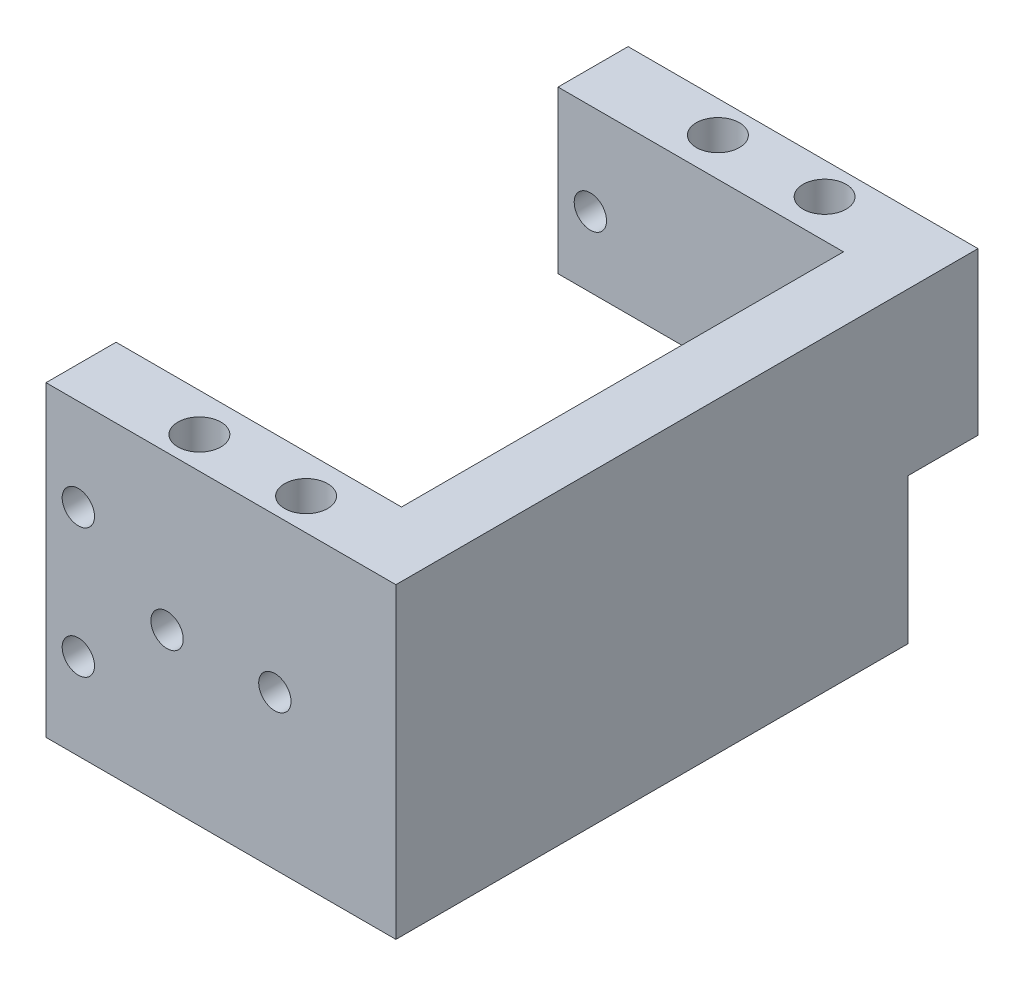
ISO-10303-21;
HEADER;
FILE_DESCRIPTION(('STEP AP214'),'2;1');
FILE_NAME('part.step','',(''),(''),'','','');
FILE_SCHEMA(('AUTOMOTIVE_DESIGN { 1 0 10303 214 1 1 1 1 }'));
ENDSEC;
DATA;
#1=APPLICATION_CONTEXT('core data for automotive mechanical design processes');
#2=APPLICATION_PROTOCOL_DEFINITION('international standard','automotive_design',2000,#1);
#3=PRODUCT_CONTEXT('',#1,'mechanical');
#4=PRODUCT('Part','Part','',(#3));
#5=PRODUCT_RELATED_PRODUCT_CATEGORY('part','',(#4));
#6=PRODUCT_DEFINITION_FORMATION('','',#4);
#7=PRODUCT_DEFINITION_CONTEXT('part definition',#1,'design');
#8=PRODUCT_DEFINITION('design','',#6,#7);
#9=PRODUCT_DEFINITION_SHAPE('','',#8);
#10=(LENGTH_UNIT() NAMED_UNIT(*) SI_UNIT(.MILLI.,.METRE.));
#11=(NAMED_UNIT(*) PLANE_ANGLE_UNIT() SI_UNIT($,.RADIAN.));
#12=(NAMED_UNIT(*) SI_UNIT($,.STERADIAN.) SOLID_ANGLE_UNIT());
#13=UNCERTAINTY_MEASURE_WITH_UNIT(LENGTH_MEASURE(1.E-05),#10,'distance_accuracy_value','');
#14=(GEOMETRIC_REPRESENTATION_CONTEXT(3) GLOBAL_UNCERTAINTY_ASSIGNED_CONTEXT((#13)) GLOBAL_UNIT_ASSIGNED_CONTEXT((#10,
#11,#12)) REPRESENTATION_CONTEXT('',''));
#15=CARTESIAN_POINT('',(0.,0.,0.));
#16=DIRECTION('',(0.,0.,1.));
#17=DIRECTION('',(1.,0.,0.));
#18=AXIS2_PLACEMENT_3D('',#15,#16,#17);
#19=CARTESIAN_POINT('',(-16.23,28.5,0.));
#20=DIRECTION('',(-1.,0.,0.));
#21=DIRECTION('',(0.,0.,1.));
#22=AXIS2_PLACEMENT_3D('',#19,#20,#21);
#23=PLANE('',#22);
#24=DIRECTION('',(0.,-1.,0.));
#25=VECTOR('',#24,1.);
#26=CARTESIAN_POINT('',(-16.23,0.,-23.75));
#27=LINE('',#26,#25);
#28=CARTESIAN_POINT('',(-16.23,28.5,-23.75));
#29=VERTEX_POINT('',#28);
#30=CARTESIAN_POINT('',(-16.23,13.5,-23.75));
#31=VERTEX_POINT('',#30);
#32=EDGE_CURVE('E129',#29,#31,#27,.T.);
#33=ORIENTED_EDGE('',*,*,#32,.F.);
#34=DIRECTION('',(0.,0.,-1.));
#35=VECTOR('',#34,1.);
#36=CARTESIAN_POINT('',(-16.23,28.5,0.));
#37=LINE('',#36,#35);
#38=CARTESIAN_POINT('',(-16.23,28.5,-30.25));
#39=VERTEX_POINT('',#38);
#40=EDGE_CURVE('E120',#29,#39,#37,.T.);
#41=ORIENTED_EDGE('',*,*,#40,.T.);
#42=DIRECTION('',(0.,-1.,0.));
#43=VECTOR('',#42,1.);
#44=CARTESIAN_POINT('',(-16.23,28.5,-30.25));
#45=LINE('',#44,#43);
#46=CARTESIAN_POINT('',(-16.23,13.5,-30.25));
#47=VERTEX_POINT('',#46);
#48=EDGE_CURVE('E208',#39,#47,#45,.T.);
#49=ORIENTED_EDGE('',*,*,#48,.T.);
#50=DIRECTION('',(0.,0.,1.));
#51=VECTOR('',#50,1.);
#52=CARTESIAN_POINT('',(-16.23,13.5,-23.75));
#53=LINE('',#52,#51);
#54=EDGE_CURVE('E213',#47,#31,#53,.T.);
#55=ORIENTED_EDGE('',*,*,#54,.T.);
#56=EDGE_LOOP('',(#33,#41,#49,#55));
#57=FACE_BOUND('',#56,.T.);
#58=ADVANCED_FACE('F35',(#57),#23,.T.);
#59=CARTESIAN_POINT('',(0.,28.5,17.25));
#60=DIRECTION('',(0.,0.,-1.));
#61=DIRECTION('',(-1.,0.,0.));
#62=AXIS2_PLACEMENT_3D('',#59,#60,#61);
#63=PLANE('',#62);
#64=CARTESIAN_POINT('',(-13.23,20.,17.25));
#65=DIRECTION('',(0.,0.,-1.));
#66=DIRECTION('',(-1.,0.,0.));
#67=AXIS2_PLACEMENT_3D('',#64,#65,#66);
#68=CIRCLE('',#67,1.5);
#69=CARTESIAN_POINT('',(-13.23,21.5,17.25));
#70=VERTEX_POINT('',#69);
#71=EDGE_CURVE('E406',#70,#70,#68,.T.);
#72=ORIENTED_EDGE('',*,*,#71,.F.);
#73=EDGE_LOOP('',(#72));
#74=FACE_BOUND('',#73,.T.);
#75=CARTESIAN_POINT('',(-13.23,7.99999999999998,17.25));
#76=DIRECTION('',(0.,0.,-1.));
#77=DIRECTION('',(-1.,0.,0.));
#78=AXIS2_PLACEMENT_3D('',#75,#76,#77);
#79=CIRCLE('',#78,1.5);
#80=CARTESIAN_POINT('',(-13.23,9.49999999999998,17.25));
#81=VERTEX_POINT('',#80);
#82=EDGE_CURVE('E318',#81,#81,#79,.T.);
#83=ORIENTED_EDGE('',*,*,#82,.F.);
#84=EDGE_LOOP('',(#83));
#85=FACE_BOUND('',#84,.T.);
#86=CARTESIAN_POINT('',(5.,14.25,17.25));
#87=DIRECTION('',(0.,0.,-1.));
#88=DIRECTION('',(-1.,0.,0.));
#89=AXIS2_PLACEMENT_3D('',#86,#87,#88);
#90=CIRCLE('',#89,3.);
#91=CARTESIAN_POINT('',(2.,14.25,17.25));
#92=VERTEX_POINT('',#91);
#93=EDGE_CURVE('E327',#92,#92,#90,.T.);
#94=ORIENTED_EDGE('',*,*,#93,.F.);
#95=EDGE_LOOP('',(#94));
#96=FACE_BOUND('',#95,.T.);
#97=DIRECTION('',(1.,0.,0.));
#98=VECTOR('',#97,1.);
#99=CARTESIAN_POINT('',(0.,0.,17.25));
#100=LINE('',#99,#98);
#101=CARTESIAN_POINT('',(-16.23,0.,17.25));
#102=VERTEX_POINT('',#101);
#103=CARTESIAN_POINT('',(10.25,0.,17.25));
#104=VERTEX_POINT('',#103);
#105=EDGE_CURVE('E51',#102,#104,#100,.T.);
#106=ORIENTED_EDGE('',*,*,#105,.F.);
#107=DIRECTION('',(0.,1.,0.));
#108=VECTOR('',#107,1.);
#109=CARTESIAN_POINT('',(-16.23,0.,17.25));
#110=LINE('',#109,#108);
#111=CARTESIAN_POINT('',(-16.23,28.5,17.25));
#112=VERTEX_POINT('',#111);
#113=EDGE_CURVE('E122',#102,#112,#110,.T.);
#114=ORIENTED_EDGE('',*,*,#113,.T.);
#115=DIRECTION('',(1.,0.,0.));
#116=VECTOR('',#115,1.);
#117=CARTESIAN_POINT('',(0.,28.5,17.25));
#118=LINE('',#117,#116);
#119=CARTESIAN_POINT('',(10.25,28.5,17.25));
#120=VERTEX_POINT('',#119);
#121=EDGE_CURVE('E111',#112,#120,#118,.T.);
#122=ORIENTED_EDGE('',*,*,#121,.T.);
#123=DIRECTION('',(0.,-1.,0.));
#124=VECTOR('',#123,1.);
#125=CARTESIAN_POINT('',(10.25,28.5,17.25));
#126=LINE('',#125,#124);
#127=EDGE_CURVE('E11',#120,#104,#126,.T.);
#128=ORIENTED_EDGE('',*,*,#127,.T.);
#129=EDGE_LOOP('',(#106,#114,#122,#128));
#130=FACE_BOUND('',#129,.T.);
#131=CARTESIAN_POINT('',(-5.,14.25,17.25));
#132=DIRECTION('',(0.,0.,-1.));
#133=DIRECTION('',(-1.,0.,0.));
#134=AXIS2_PLACEMENT_3D('',#131,#132,#133);
#135=CIRCLE('',#134,3.);
#136=CARTESIAN_POINT('',(-8.00000000000001,14.25,17.25));
#137=VERTEX_POINT('',#136);
#138=EDGE_CURVE('E128',#137,#137,#135,.F.);
#139=ORIENTED_EDGE('',*,*,#138,.T.);
#140=EDGE_LOOP('',(#139));
#141=FACE_BOUND('',#140,.T.);
#142=ADVANCED_FACE('F123',(#74,#85,#96,#130,#141),#63,.T.);
#143=CARTESIAN_POINT('',(-5.,14.25,27.25));
#144=DIRECTION('',(0.,0.,-1.));
#145=DIRECTION('',(-1.,0.,0.));
#146=AXIS2_PLACEMENT_3D('',#143,#144,#145);
#147=CYLINDRICAL_SURFACE('',#146,1.5);
#148=CARTESIAN_POINT('',(-5.,14.25,23.75));
#149=DIRECTION('',(0.,0.,-1.));
#150=DIRECTION('',(-1.,0.,0.));
#151=AXIS2_PLACEMENT_3D('',#148,#149,#150);
#152=CIRCLE('',#151,1.5);
#153=CARTESIAN_POINT('',(-6.5,14.25,23.75));
#154=VERTEX_POINT('',#153);
#155=EDGE_CURVE('E174',#154,#154,#152,.F.);
#156=ORIENTED_EDGE('',*,*,#155,.T.);
#157=EDGE_LOOP('',(#156));
#158=FACE_BOUND('',#157,.T.);
#159=CARTESIAN_POINT('',(-5.,14.25,20.75));
#160=DIRECTION('',(0.,0.,-1.));
#161=DIRECTION('',(-1.,0.,0.));
#162=AXIS2_PLACEMENT_3D('',#159,#160,#161);
#163=CIRCLE('',#162,1.5);
#164=CARTESIAN_POINT('',(-6.5,14.25,20.75));
#165=VERTEX_POINT('',#164);
#166=EDGE_CURVE('E332',#165,#165,#163,.F.);
#167=ORIENTED_EDGE('',*,*,#166,.F.);
#168=EDGE_LOOP('',(#167));
#169=FACE_BOUND('',#168,.T.);
#170=ADVANCED_FACE('F276',(#158,#169),#147,.F.);
#171=CARTESIAN_POINT('',(5.,14.25,27.25));
#172=DIRECTION('',(0.,0.,-1.));
#173=DIRECTION('',(-1.,0.,0.));
#174=AXIS2_PLACEMENT_3D('',#171,#172,#173);
#175=CYLINDRICAL_SURFACE('',#174,1.5);
#176=CARTESIAN_POINT('',(5.,14.25,23.75));
#177=DIRECTION('',(0.,0.,-1.));
#178=DIRECTION('',(-1.,0.,0.));
#179=AXIS2_PLACEMENT_3D('',#176,#177,#178);
#180=CIRCLE('',#179,1.5);
#181=CARTESIAN_POINT('',(3.5,14.25,23.75));
#182=VERTEX_POINT('',#181);
#183=EDGE_CURVE('E176',#182,#182,#180,.T.);
#184=ORIENTED_EDGE('',*,*,#183,.F.);
#185=EDGE_LOOP('',(#184));
#186=FACE_BOUND('',#185,.T.);
#187=CARTESIAN_POINT('',(5.,14.25,20.75));
#188=DIRECTION('',(0.,0.,-1.));
#189=DIRECTION('',(-1.,0.,0.));
#190=AXIS2_PLACEMENT_3D('',#187,#188,#189);
#191=CIRCLE('',#190,1.5);
#192=CARTESIAN_POINT('',(3.5,14.25,20.75));
#193=VERTEX_POINT('',#192);
#194=EDGE_CURVE('E324',#193,#193,#191,.T.);
#195=ORIENTED_EDGE('',*,*,#194,.T.);
#196=EDGE_LOOP('',(#195));
#197=FACE_BOUND('',#196,.T.);
#198=ADVANCED_FACE('F392',(#186,#197),#175,.F.);
#199=CARTESIAN_POINT('',(0.,28.5,23.75));
#200=DIRECTION('',(0.,0.,-1.));
#201=DIRECTION('',(-1.,0.,0.));
#202=AXIS2_PLACEMENT_3D('',#199,#200,#201);
#203=PLANE('',#202);
#204=CARTESIAN_POINT('',(-13.23,20.,23.75));
#205=DIRECTION('',(0.,0.,-1.));
#206=DIRECTION('',(-1.,0.,0.));
#207=AXIS2_PLACEMENT_3D('',#204,#205,#206);
#208=CIRCLE('',#207,1.5);
#209=CARTESIAN_POINT('',(-13.23,21.5,23.75));
#210=VERTEX_POINT('',#209);
#211=EDGE_CURVE('E402',#210,#210,#208,.T.);
#212=ORIENTED_EDGE('',*,*,#211,.T.);
#213=EDGE_LOOP('',(#212));
#214=FACE_BOUND('',#213,.T.);
#215=CARTESIAN_POINT('',(-13.23,7.99999999999998,23.75));
#216=DIRECTION('',(0.,0.,-1.));
#217=DIRECTION('',(-1.,0.,0.));
#218=AXIS2_PLACEMENT_3D('',#215,#216,#217);
#219=CIRCLE('',#218,1.5);
#220=CARTESIAN_POINT('',(-13.23,9.49999999999998,23.75));
#221=VERTEX_POINT('',#220);
#222=EDGE_CURVE('E39',#221,#221,#219,.T.);
#223=ORIENTED_EDGE('',*,*,#222,.T.);
#224=EDGE_LOOP('',(#223));
#225=FACE_BOUND('',#224,.T.);
#226=DIRECTION('',(1.,0.,0.));
#227=VECTOR('',#226,1.);
#228=CARTESIAN_POINT('',(0.,0.,23.75));
#229=LINE('',#228,#227);
#230=CARTESIAN_POINT('',(-16.23,0.,23.75));
#231=VERTEX_POINT('',#230);
#232=CARTESIAN_POINT('',(16.23,0.,23.75));
#233=VERTEX_POINT('',#232);
#234=EDGE_CURVE('E148',#231,#233,#229,.T.);
#235=ORIENTED_EDGE('',*,*,#234,.T.);
#236=DIRECTION('',(0.,-1.,0.));
#237=VECTOR('',#236,1.);
#238=CARTESIAN_POINT('',(16.23,28.5,23.75));
#239=LINE('',#238,#237);
#240=CARTESIAN_POINT('',(16.23,28.5,23.75));
#241=VERTEX_POINT('',#240);
#242=EDGE_CURVE('E161',#241,#233,#239,.T.);
#243=ORIENTED_EDGE('',*,*,#242,.F.);
#244=DIRECTION('',(1.,0.,0.));
#245=VECTOR('',#244,1.);
#246=CARTESIAN_POINT('',(0.,28.5,23.75));
#247=LINE('',#246,#245);
#248=CARTESIAN_POINT('',(-16.23,28.5,23.75));
#249=VERTEX_POINT('',#248);
#250=EDGE_CURVE('E133',#249,#241,#247,.T.);
#251=ORIENTED_EDGE('',*,*,#250,.F.);
#252=DIRECTION('',(0.,-1.,0.));
#253=VECTOR('',#252,1.);
#254=CARTESIAN_POINT('',(-16.23,28.5,23.75));
#255=LINE('',#254,#253);
#256=EDGE_CURVE('E44',#249,#231,#255,.T.);
#257=ORIENTED_EDGE('',*,*,#256,.T.);
#258=EDGE_LOOP('',(#235,#243,#251,#257));
#259=FACE_BOUND('',#258,.T.);
#260=ORIENTED_EDGE('',*,*,#155,.F.);
#261=EDGE_LOOP('',(#260));
#262=FACE_BOUND('',#261,.T.);
#263=ORIENTED_EDGE('',*,*,#183,.T.);
#264=EDGE_LOOP('',(#263));
#265=FACE_BOUND('',#264,.T.);
#266=ADVANCED_FACE('F246',(#214,#225,#259,#262,#265),#203,.F.);
#267=CARTESIAN_POINT('',(0.,0.,0.));
#268=DIRECTION('',(0.,1.,0.));
#269=DIRECTION('',(0.,0.,1.));
#270=AXIS2_PLACEMENT_3D('',#267,#268,#269);
#271=PLANE('',#270);
#272=CARTESIAN_POINT('',(13.23,0.,13.25));
#273=DIRECTION('',(0.,1.,0.));
#274=DIRECTION('',(0.,0.,1.));
#275=AXIS2_PLACEMENT_3D('',#272,#273,#274);
#276=CIRCLE('',#275,1.5);
#277=CARTESIAN_POINT('',(13.23,0.,14.75));
#278=VERTEX_POINT('',#277);
#279=EDGE_CURVE('E222',#278,#278,#276,.T.);
#280=ORIENTED_EDGE('',*,*,#279,.T.);
#281=EDGE_LOOP('',(#280));
#282=FACE_BOUND('',#281,.T.);
#283=DIRECTION('',(0.,0.,-1.));
#284=VECTOR('',#283,1.);
#285=CARTESIAN_POINT('',(-16.23,0.,0.));
#286=LINE('',#285,#284);
#287=EDGE_CURVE('E146',#231,#102,#286,.T.);
#288=ORIENTED_EDGE('',*,*,#287,.T.);
#289=ORIENTED_EDGE('',*,*,#105,.T.);
#290=DIRECTION('',(0.,0.,1.));
#291=VECTOR('',#290,1.);
#292=CARTESIAN_POINT('',(10.25,0.,0.));
#293=LINE('',#292,#291);
#294=CARTESIAN_POINT('',(10.25,0.,-23.75));
#295=VERTEX_POINT('',#294);
#296=EDGE_CURVE('E141',#295,#104,#293,.T.);
#297=ORIENTED_EDGE('',*,*,#296,.F.);
#298=DIRECTION('',(1.,0.,0.));
#299=VECTOR('',#298,1.);
#300=CARTESIAN_POINT('',(0.,0.,-23.75));
#301=LINE('',#300,#299);
#302=CARTESIAN_POINT('',(16.23,0.,-23.75));
#303=VERTEX_POINT('',#302);
#304=EDGE_CURVE('E153',#295,#303,#301,.T.);
#305=ORIENTED_EDGE('',*,*,#304,.T.);
#306=DIRECTION('',(0.,0.,-1.));
#307=VECTOR('',#306,1.);
#308=CARTESIAN_POINT('',(16.23,0.,0.));
#309=LINE('',#308,#307);
#310=EDGE_CURVE('E150',#233,#303,#309,.T.);
#311=ORIENTED_EDGE('',*,*,#310,.F.);
#312=ORIENTED_EDGE('',*,*,#234,.F.);
#313=EDGE_LOOP('',(#288,#289,#297,#305,#311,#312));
#314=FACE_BOUND('',#313,.T.);
#315=CARTESIAN_POINT('',(13.23,0.,-19.75));
#316=DIRECTION('',(0.,1.,0.));
#317=DIRECTION('',(0.,0.,1.));
#318=AXIS2_PLACEMENT_3D('',#315,#316,#317);
#319=CIRCLE('',#318,1.5);
#320=CARTESIAN_POINT('',(13.23,0.,-18.25));
#321=VERTEX_POINT('',#320);
#322=EDGE_CURVE('E233',#321,#321,#319,.F.);
#323=ORIENTED_EDGE('',*,*,#322,.F.);
#324=EDGE_LOOP('',(#323));
#325=FACE_BOUND('',#324,.T.);
#326=CARTESIAN_POINT('',(4.95,0.,20.8));
#327=DIRECTION('',(0.,1.,0.));
#328=DIRECTION('',(0.,0.,1.));
#329=AXIS2_PLACEMENT_3D('',#326,#327,#328);
#330=CIRCLE('',#329,2.);
#331=CARTESIAN_POINT('',(4.95,0.,22.8));
#332=VERTEX_POINT('',#331);
#333=EDGE_CURVE('E200',#332,#332,#330,.T.);
#334=ORIENTED_EDGE('',*,*,#333,.T.);
#335=EDGE_LOOP('',(#334));
#336=FACE_BOUND('',#335,.T.);
#337=CARTESIAN_POINT('',(-4.95,0.,20.8));
#338=DIRECTION('',(0.,1.,0.));
#339=DIRECTION('',(0.,0.,1.));
#340=AXIS2_PLACEMENT_3D('',#337,#338,#339);
#341=CIRCLE('',#340,2.);
#342=CARTESIAN_POINT('',(-4.95,0.,22.8));
#343=VERTEX_POINT('',#342);
#344=EDGE_CURVE('E194',#343,#343,#341,.F.);
#345=ORIENTED_EDGE('',*,*,#344,.F.);
#346=EDGE_LOOP('',(#345));
#347=FACE_BOUND('',#346,.T.);
#348=ADVANCED_FACE('F243',(#282,#314,#325,#336,#347),#271,.F.);
#349=CARTESIAN_POINT('',(0.,28.5,0.));
#350=DIRECTION('',(0.,1.,0.));
#351=DIRECTION('',(0.,0.,1.));
#352=AXIS2_PLACEMENT_3D('',#349,#350,#351);
#353=PLANE('',#352);
#354=ORIENTED_EDGE('',*,*,#40,.F.);
#355=DIRECTION('',(-1.,0.,0.));
#356=VECTOR('',#355,1.);
#357=CARTESIAN_POINT('',(16.23,28.5,-23.75));
#358=LINE('',#357,#356);
#359=CARTESIAN_POINT('',(10.25,28.5,-23.75));
#360=VERTEX_POINT('',#359);
#361=EDGE_CURVE('E216',#360,#29,#358,.T.);
#362=ORIENTED_EDGE('',*,*,#361,.F.);
#363=DIRECTION('',(0.,0.,1.));
#364=VECTOR('',#363,1.);
#365=CARTESIAN_POINT('',(10.25,28.5,0.));
#366=LINE('',#365,#364);
#367=EDGE_CURVE('E118',#360,#120,#366,.T.);
#368=ORIENTED_EDGE('',*,*,#367,.T.);
#369=ORIENTED_EDGE('',*,*,#121,.F.);
#370=EDGE_CURVE('E116',#249,#112,#37,.T.);
#371=ORIENTED_EDGE('',*,*,#370,.F.);
#372=ORIENTED_EDGE('',*,*,#250,.T.);
#373=DIRECTION('',(0.,0.,-1.));
#374=VECTOR('',#373,1.);
#375=CARTESIAN_POINT('',(16.23,28.5,0.));
#376=LINE('',#375,#374);
#377=CARTESIAN_POINT('',(16.23,28.5,-30.25));
#378=VERTEX_POINT('',#377);
#379=EDGE_CURVE('E135',#241,#378,#376,.T.);
#380=ORIENTED_EDGE('',*,*,#379,.T.);
#381=DIRECTION('',(-1.,0.,0.));
#382=VECTOR('',#381,1.);
#383=CARTESIAN_POINT('',(16.23,28.5,-30.25));
#384=LINE('',#383,#382);
#385=EDGE_CURVE('E226',#378,#39,#384,.T.);
#386=ORIENTED_EDGE('',*,*,#385,.T.);
#387=EDGE_LOOP('',(#354,#362,#368,#369,#371,#372,#380,#386));
#388=FACE_BOUND('',#387,.T.);
#389=CARTESIAN_POINT('',(-4.95,28.5,20.8));
#390=DIRECTION('',(0.,1.,0.));
#391=DIRECTION('',(0.,0.,1.));
#392=AXIS2_PLACEMENT_3D('',#389,#390,#391);
#393=CIRCLE('',#392,2.);
#394=CARTESIAN_POINT('',(-4.95,28.5,22.8));
#395=VERTEX_POINT('',#394);
#396=EDGE_CURVE('E188',#395,#395,#393,.T.);
#397=ORIENTED_EDGE('',*,*,#396,.F.);
#398=EDGE_LOOP('',(#397));
#399=FACE_BOUND('',#398,.T.);
#400=CARTESIAN_POINT('',(4.95,28.5,20.8));
#401=DIRECTION('',(0.,1.,0.));
#402=DIRECTION('',(0.,0.,1.));
#403=AXIS2_PLACEMENT_3D('',#400,#401,#402);
#404=CIRCLE('',#403,2.);
#405=CARTESIAN_POINT('',(4.95,28.5,22.8));
#406=VERTEX_POINT('',#405);
#407=EDGE_CURVE('E179',#406,#406,#404,.T.);
#408=ORIENTED_EDGE('',*,*,#407,.F.);
#409=EDGE_LOOP('',(#408));
#410=FACE_BOUND('',#409,.T.);
#411=CARTESIAN_POINT('',(4.95,28.5,-27.3));
#412=DIRECTION('',(0.,1.,0.));
#413=DIRECTION('',(0.,0.,1.));
#414=AXIS2_PLACEMENT_3D('',#411,#412,#413);
#415=CIRCLE('',#414,2.);
#416=CARTESIAN_POINT('',(4.95,28.5,-25.3));
#417=VERTEX_POINT('',#416);
#418=EDGE_CURVE('E168',#417,#417,#415,.T.);
#419=ORIENTED_EDGE('',*,*,#418,.F.);
#420=EDGE_LOOP('',(#419));
#421=FACE_BOUND('',#420,.T.);
#422=CARTESIAN_POINT('',(-4.95,28.5,-27.3));
#423=DIRECTION('',(0.,1.,0.));
#424=DIRECTION('',(0.,0.,1.));
#425=AXIS2_PLACEMENT_3D('',#422,#423,#424);
#426=CIRCLE('',#425,2.);
#427=CARTESIAN_POINT('',(-4.95,28.5,-25.3));
#428=VERTEX_POINT('',#427);
#429=EDGE_CURVE('E173',#428,#428,#426,.F.);
#430=ORIENTED_EDGE('',*,*,#429,.T.);
#431=EDGE_LOOP('',(#430));
#432=FACE_BOUND('',#431,.T.);
#433=ADVANCED_FACE('F113',(#388,#399,#410,#421,#432),#353,.T.);
#434=CARTESIAN_POINT('',(16.23,13.5,-23.75));
#435=DIRECTION('',(0.,-1.,0.));
#436=DIRECTION('',(0.,0.,-1.));
#437=AXIS2_PLACEMENT_3D('',#434,#435,#436);
#438=PLANE('',#437);
#439=ORIENTED_EDGE('',*,*,#54,.F.);
#440=DIRECTION('',(-1.,0.,0.));
#441=VECTOR('',#440,1.);
#442=CARTESIAN_POINT('',(16.23,13.5,-30.25));
#443=LINE('',#442,#441);
#444=CARTESIAN_POINT('',(16.23,13.5,-30.25));
#445=VERTEX_POINT('',#444);
#446=EDGE_CURVE('E224',#445,#47,#443,.T.);
#447=ORIENTED_EDGE('',*,*,#446,.F.);
#448=DIRECTION('',(0.,0.,1.));
#449=VECTOR('',#448,1.);
#450=CARTESIAN_POINT('',(16.23,13.5,-23.75));
#451=LINE('',#450,#449);
#452=CARTESIAN_POINT('',(16.23,13.5,-23.75));
#453=VERTEX_POINT('',#452);
#454=EDGE_CURVE('E212',#445,#453,#451,.T.);
#455=ORIENTED_EDGE('',*,*,#454,.T.);
#456=DIRECTION('',(-1.,0.,0.));
#457=VECTOR('',#456,1.);
#458=CARTESIAN_POINT('',(16.23,13.5,-23.75));
#459=LINE('',#458,#457);
#460=CARTESIAN_POINT('',(10.25,13.5,-23.75));
#461=VERTEX_POINT('',#460);
#462=EDGE_CURVE('E59',#453,#461,#459,.T.);
#463=ORIENTED_EDGE('',*,*,#462,.T.);
#464=EDGE_CURVE('E223',#461,#31,#459,.T.);
#465=ORIENTED_EDGE('',*,*,#464,.T.);
#466=EDGE_LOOP('',(#439,#447,#455,#463,#465));
#467=FACE_BOUND('',#466,.T.);
#468=CARTESIAN_POINT('',(4.95,13.5,-27.3));
#469=DIRECTION('',(0.,-1.,0.));
#470=DIRECTION('',(0.,0.,-1.));
#471=AXIS2_PLACEMENT_3D('',#468,#469,#470);
#472=CIRCLE('',#471,2.);
#473=CARTESIAN_POINT('',(4.95,13.5,-29.3));
#474=VERTEX_POINT('',#473);
#475=EDGE_CURVE('E165',#474,#474,#472,.T.);
#476=ORIENTED_EDGE('',*,*,#475,.F.);
#477=EDGE_LOOP('',(#476));
#478=FACE_BOUND('',#477,.T.);
#479=CARTESIAN_POINT('',(-4.95,13.5,-27.3));
#480=DIRECTION('',(0.,-1.,0.));
#481=DIRECTION('',(0.,0.,-1.));
#482=AXIS2_PLACEMENT_3D('',#479,#480,#481);
#483=CIRCLE('',#482,2.);
#484=CARTESIAN_POINT('',(-4.95,13.5,-29.3));
#485=VERTEX_POINT('',#484);
#486=EDGE_CURVE('E170',#485,#485,#483,.F.);
#487=ORIENTED_EDGE('',*,*,#486,.T.);
#488=EDGE_LOOP('',(#487));
#489=FACE_BOUND('',#488,.T.);
#490=ADVANCED_FACE('F289',(#467,#478,#489),#438,.T.);
#491=CARTESIAN_POINT('',(10.25,28.5,0.));
#492=DIRECTION('',(1.,0.,0.));
#493=DIRECTION('',(0.,0.,-1.));
#494=AXIS2_PLACEMENT_3D('',#491,#492,#493);
#495=PLANE('',#494);
#496=ORIENTED_EDGE('',*,*,#296,.T.);
#497=ORIENTED_EDGE('',*,*,#127,.F.);
#498=ORIENTED_EDGE('',*,*,#367,.F.);
#499=DIRECTION('',(0.,-1.,0.));
#500=VECTOR('',#499,1.);
#501=CARTESIAN_POINT('',(10.25,28.5,-23.75));
#502=LINE('',#501,#500);
#503=EDGE_CURVE('E156',#360,#461,#502,.T.);
#504=ORIENTED_EDGE('',*,*,#503,.T.);
#505=EDGE_CURVE('E140',#461,#295,#502,.T.);
#506=ORIENTED_EDGE('',*,*,#505,.T.);
#507=EDGE_LOOP('',(#496,#497,#498,#504,#506));
#508=FACE_BOUND('',#507,.T.);
#509=ADVANCED_FACE('F37',(#508),#495,.F.);
#510=ORIENTED_EDGE('',*,*,#113,.F.);
#511=ORIENTED_EDGE('',*,*,#287,.F.);
#512=ORIENTED_EDGE('',*,*,#256,.F.);
#513=ORIENTED_EDGE('',*,*,#370,.T.);
#514=EDGE_LOOP('',(#510,#511,#512,#513));
#515=FACE_BOUND('',#514,.T.);
#516=ADVANCED_FACE('F131',(#515),#23,.T.);
#517=CARTESIAN_POINT('',(16.23,28.5,0.));
#518=DIRECTION('',(-1.,0.,0.));
#519=DIRECTION('',(0.,0.,1.));
#520=AXIS2_PLACEMENT_3D('',#517,#518,#519);
#521=PLANE('',#520);
#522=ORIENTED_EDGE('',*,*,#310,.T.);
#523=DIRECTION('',(0.,-1.,0.));
#524=VECTOR('',#523,1.);
#525=CARTESIAN_POINT('',(16.23,28.5,-23.75));
#526=LINE('',#525,#524);
#527=EDGE_CURVE('E159',#453,#303,#526,.T.);
#528=ORIENTED_EDGE('',*,*,#527,.F.);
#529=ORIENTED_EDGE('',*,*,#454,.F.);
#530=DIRECTION('',(0.,-1.,0.));
#531=VECTOR('',#530,1.);
#532=CARTESIAN_POINT('',(16.23,28.5,-30.25));
#533=LINE('',#532,#531);
#534=EDGE_CURVE('E209',#378,#445,#533,.T.);
#535=ORIENTED_EDGE('',*,*,#534,.F.);
#536=ORIENTED_EDGE('',*,*,#379,.F.);
#537=ORIENTED_EDGE('',*,*,#242,.T.);
#538=EDGE_LOOP('',(#522,#528,#529,#535,#536,#537));
#539=FACE_BOUND('',#538,.T.);
#540=ADVANCED_FACE('F281',(#539),#521,.F.);
#541=CARTESIAN_POINT('',(0.,28.5,-23.75));
#542=DIRECTION('',(0.,0.,-1.));
#543=DIRECTION('',(-1.,0.,0.));
#544=AXIS2_PLACEMENT_3D('',#541,#542,#543);
#545=PLANE('',#544);
#546=ORIENTED_EDGE('',*,*,#462,.F.);
#547=ORIENTED_EDGE('',*,*,#527,.T.);
#548=ORIENTED_EDGE('',*,*,#304,.F.);
#549=ORIENTED_EDGE('',*,*,#505,.F.);
#550=EDGE_LOOP('',(#546,#547,#548,#549));
#551=FACE_BOUND('',#550,.T.);
#552=ADVANCED_FACE('F286',(#551),#545,.T.);
#553=CARTESIAN_POINT('',(13.23,15.,-19.75));
#554=DIRECTION('',(0.,-1.,0.));
#555=DIRECTION('',(0.,0.,-1.));
#556=AXIS2_PLACEMENT_3D('',#553,#554,#555);
#557=CYLINDRICAL_SURFACE('',#556,1.5);
#558=CARTESIAN_POINT('',(13.23,15.,-19.75));
#559=DIRECTION('',(0.,1.,0.));
#560=DIRECTION('',(0.,0.,1.));
#561=AXIS2_PLACEMENT_3D('',#558,#559,#560);
#562=CIRCLE('',#561,1.5);
#563=CARTESIAN_POINT('',(13.23,15.,-18.25));
#564=VERTEX_POINT('',#563);
#565=EDGE_CURVE('E144',#564,#564,#562,.F.);
#566=ORIENTED_EDGE('',*,*,#565,.F.);
#567=EDGE_LOOP('',(#566));
#568=FACE_BOUND('',#567,.T.);
#569=ORIENTED_EDGE('',*,*,#322,.T.);
#570=EDGE_LOOP('',(#569));
#571=FACE_BOUND('',#570,.T.);
#572=ADVANCED_FACE('F241',(#568,#571),#557,.F.);
#573=CARTESIAN_POINT('',(0.,15.,0.));
#574=DIRECTION('',(0.,1.,0.));
#575=DIRECTION('',(0.,0.,1.));
#576=AXIS2_PLACEMENT_3D('',#573,#574,#575);
#577=PLANE('',#576);
#578=ORIENTED_EDGE('',*,*,#565,.T.);
#579=EDGE_LOOP('',(#578));
#580=FACE_BOUND('',#579,.T.);
#581=ADVANCED_FACE('F382',(#580),#577,.F.);
#582=CARTESIAN_POINT('',(13.23,15.,13.25));
#583=DIRECTION('',(0.,-1.,0.));
#584=DIRECTION('',(0.,0.,-1.));
#585=AXIS2_PLACEMENT_3D('',#582,#583,#584);
#586=CYLINDRICAL_SURFACE('',#585,1.5);
#587=CARTESIAN_POINT('',(13.23,15.,13.25));
#588=DIRECTION('',(0.,1.,0.));
#589=DIRECTION('',(0.,0.,1.));
#590=AXIS2_PLACEMENT_3D('',#587,#588,#589);
#591=CIRCLE('',#590,1.5);
#592=CARTESIAN_POINT('',(13.23,15.,14.75));
#593=VERTEX_POINT('',#592);
#594=EDGE_CURVE('E230',#593,#593,#591,.T.);
#595=ORIENTED_EDGE('',*,*,#594,.T.);
#596=EDGE_LOOP('',(#595));
#597=FACE_BOUND('',#596,.T.);
#598=ORIENTED_EDGE('',*,*,#279,.F.);
#599=EDGE_LOOP('',(#598));
#600=FACE_BOUND('',#599,.T.);
#601=ADVANCED_FACE('F378',(#597,#600),#586,.F.);
#602=CARTESIAN_POINT('',(0.,15.,0.));
#603=DIRECTION('',(0.,1.,0.));
#604=DIRECTION('',(0.,0.,1.));
#605=AXIS2_PLACEMENT_3D('',#602,#603,#604);
#606=PLANE('',#605);
#607=ORIENTED_EDGE('',*,*,#594,.F.);
#608=EDGE_LOOP('',(#607));
#609=FACE_BOUND('',#608,.T.);
#610=ADVANCED_FACE('F374',(#609),#606,.F.);
#611=CARTESIAN_POINT('',(16.23,28.5,-23.75));
#612=DIRECTION('',(0.,0.,1.));
#613=DIRECTION('',(0.,-1.,0.));
#614=AXIS2_PLACEMENT_3D('',#611,#612,#613);
#615=PLANE('',#614);
#616=CARTESIAN_POINT('',(-13.23,20.,-23.75));
#617=DIRECTION('',(0.,0.,1.));
#618=DIRECTION('',(0.,-1.,0.));
#619=AXIS2_PLACEMENT_3D('',#616,#617,#618);
#620=CIRCLE('',#619,1.5);
#621=CARTESIAN_POINT('',(-13.23,18.5,-23.75));
#622=VERTEX_POINT('',#621);
#623=EDGE_CURVE('E410',#622,#622,#620,.T.);
#624=ORIENTED_EDGE('',*,*,#623,.F.);
#625=EDGE_LOOP('',(#624));
#626=FACE_BOUND('',#625,.T.);
#627=ORIENTED_EDGE('',*,*,#503,.F.);
#628=ORIENTED_EDGE('',*,*,#361,.T.);
#629=ORIENTED_EDGE('',*,*,#32,.T.);
#630=ORIENTED_EDGE('',*,*,#464,.F.);
#631=EDGE_LOOP('',(#627,#628,#629,#630));
#632=FACE_BOUND('',#631,.T.);
#633=ADVANCED_FACE('F317',(#626,#632),#615,.T.);
#634=CARTESIAN_POINT('',(16.23,28.5,-30.25));
#635=DIRECTION('',(0.,0.,-1.));
#636=DIRECTION('',(0.,1.,0.));
#637=AXIS2_PLACEMENT_3D('',#634,#635,#636);
#638=PLANE('',#637);
#639=CARTESIAN_POINT('',(-13.23,20.,-30.25));
#640=DIRECTION('',(0.,0.,-1.));
#641=DIRECTION('',(0.,1.,0.));
#642=AXIS2_PLACEMENT_3D('',#639,#640,#641);
#643=CIRCLE('',#642,1.5);
#644=CARTESIAN_POINT('',(-13.23,21.5,-30.25));
#645=VERTEX_POINT('',#644);
#646=EDGE_CURVE('E415',#645,#645,#643,.T.);
#647=ORIENTED_EDGE('',*,*,#646,.F.);
#648=EDGE_LOOP('',(#647));
#649=FACE_BOUND('',#648,.T.);
#650=ORIENTED_EDGE('',*,*,#48,.F.);
#651=ORIENTED_EDGE('',*,*,#385,.F.);
#652=ORIENTED_EDGE('',*,*,#534,.T.);
#653=ORIENTED_EDGE('',*,*,#446,.T.);
#654=EDGE_LOOP('',(#650,#651,#652,#653));
#655=FACE_BOUND('',#654,.T.);
#656=ADVANCED_FACE('F310',(#649,#655),#638,.T.);
#657=CARTESIAN_POINT('',(4.95,94.46,-27.3));
#658=DIRECTION('',(0.,-1.,0.));
#659=DIRECTION('',(0.,0.,-1.));
#660=AXIS2_PLACEMENT_3D('',#657,#658,#659);
#661=CYLINDRICAL_SURFACE('',#660,2.);
#662=ORIENTED_EDGE('',*,*,#418,.T.);
#663=EDGE_LOOP('',(#662));
#664=FACE_BOUND('',#663,.T.);
#665=ORIENTED_EDGE('',*,*,#475,.T.);
#666=EDGE_LOOP('',(#665));
#667=FACE_BOUND('',#666,.T.);
#668=ADVANCED_FACE('F356',(#664,#667),#661,.F.);
#669=CARTESIAN_POINT('',(-4.95,94.46,-27.3));
#670=DIRECTION('',(0.,-1.,0.));
#671=DIRECTION('',(0.,0.,-1.));
#672=AXIS2_PLACEMENT_3D('',#669,#670,#671);
#673=CYLINDRICAL_SURFACE('',#672,2.);
#674=ORIENTED_EDGE('',*,*,#429,.F.);
#675=EDGE_LOOP('',(#674));
#676=FACE_BOUND('',#675,.T.);
#677=ORIENTED_EDGE('',*,*,#486,.F.);
#678=EDGE_LOOP('',(#677));
#679=FACE_BOUND('',#678,.T.);
#680=ADVANCED_FACE('F353',(#676,#679),#673,.F.);
#681=CARTESIAN_POINT('',(4.95,8.,20.8));
#682=DIRECTION('',(0.,-1.,0.));
#683=DIRECTION('',(0.,0.,-1.));
#684=AXIS2_PLACEMENT_3D('',#681,#682,#683);
#685=CYLINDRICAL_SURFACE('',#684,2.);
#686=CARTESIAN_POINT('',(4.95,8.,20.8));
#687=DIRECTION('',(0.,1.,0.));
#688=DIRECTION('',(0.,0.,1.));
#689=AXIS2_PLACEMENT_3D('',#686,#687,#688);
#690=CIRCLE('',#689,2.);
#691=CARTESIAN_POINT('',(4.95,8.,22.8));
#692=VERTEX_POINT('',#691);
#693=EDGE_CURVE('E197',#692,#692,#690,.T.);
#694=ORIENTED_EDGE('',*,*,#693,.T.);
#695=EDGE_LOOP('',(#694));
#696=FACE_BOUND('',#695,.T.);
#697=ORIENTED_EDGE('',*,*,#333,.F.);
#698=EDGE_LOOP('',(#697));
#699=FACE_BOUND('',#698,.T.);
#700=ADVANCED_FACE('F266',(#696,#699),#685,.F.);
#701=CARTESIAN_POINT('',(0.,8.,0.));
#702=DIRECTION('',(0.,1.,0.));
#703=DIRECTION('',(0.,0.,1.));
#704=AXIS2_PLACEMENT_3D('',#701,#702,#703);
#705=PLANE('',#704);
#706=ORIENTED_EDGE('',*,*,#693,.F.);
#707=EDGE_LOOP('',(#706));
#708=FACE_BOUND('',#707,.T.);
#709=ADVANCED_FACE('F256',(#708),#705,.F.);
#710=CARTESIAN_POINT('',(-4.95,8.,20.8));
#711=DIRECTION('',(0.,-1.,0.));
#712=DIRECTION('',(0.,0.,-1.));
#713=AXIS2_PLACEMENT_3D('',#710,#711,#712);
#714=CYLINDRICAL_SURFACE('',#713,2.);
#715=CARTESIAN_POINT('',(-4.95,8.,20.8));
#716=DIRECTION('',(0.,1.,0.));
#717=DIRECTION('',(0.,0.,1.));
#718=AXIS2_PLACEMENT_3D('',#715,#716,#717);
#719=CIRCLE('',#718,2.);
#720=CARTESIAN_POINT('',(-4.95,8.,22.8));
#721=VERTEX_POINT('',#720);
#722=EDGE_CURVE('E169',#721,#721,#719,.F.);
#723=ORIENTED_EDGE('',*,*,#722,.F.);
#724=EDGE_LOOP('',(#723));
#725=FACE_BOUND('',#724,.T.);
#726=ORIENTED_EDGE('',*,*,#344,.T.);
#727=EDGE_LOOP('',(#726));
#728=FACE_BOUND('',#727,.T.);
#729=ADVANCED_FACE('F253',(#725,#728),#714,.F.);
#730=CARTESIAN_POINT('',(0.,8.,0.));
#731=DIRECTION('',(0.,1.,0.));
#732=DIRECTION('',(0.,0.,1.));
#733=AXIS2_PLACEMENT_3D('',#730,#731,#732);
#734=PLANE('',#733);
#735=ORIENTED_EDGE('',*,*,#722,.T.);
#736=EDGE_LOOP('',(#735));
#737=FACE_BOUND('',#736,.T.);
#738=ADVANCED_FACE('F255',(#737),#734,.F.);
#739=CARTESIAN_POINT('',(4.95,20.5,20.8));
#740=DIRECTION('',(0.,1.,0.));
#741=DIRECTION('',(0.,0.,1.));
#742=AXIS2_PLACEMENT_3D('',#739,#740,#741);
#743=CYLINDRICAL_SURFACE('',#742,2.);
#744=CARTESIAN_POINT('',(4.95,20.5,20.8));
#745=DIRECTION('',(0.,1.,0.));
#746=DIRECTION('',(0.,0.,1.));
#747=AXIS2_PLACEMENT_3D('',#744,#745,#746);
#748=CIRCLE('',#747,2.);
#749=CARTESIAN_POINT('',(4.95,20.5,22.8));
#750=VERTEX_POINT('',#749);
#751=EDGE_CURVE('E183',#750,#750,#748,.T.);
#752=ORIENTED_EDGE('',*,*,#751,.F.);
#753=EDGE_LOOP('',(#752));
#754=FACE_BOUND('',#753,.T.);
#755=ORIENTED_EDGE('',*,*,#407,.T.);
#756=EDGE_LOOP('',(#755));
#757=FACE_BOUND('',#756,.T.);
#758=ADVANCED_FACE('F263',(#754,#757),#743,.F.);
#759=CARTESIAN_POINT('',(4.95,20.5,20.8));
#760=DIRECTION('',(0.,1.,0.));
#761=DIRECTION('',(0.,0.,1.));
#762=AXIS2_PLACEMENT_3D('',#759,#760,#761);
#763=PLANE('',#762);
#764=ORIENTED_EDGE('',*,*,#751,.T.);
#765=EDGE_LOOP('',(#764));
#766=FACE_BOUND('',#765,.T.);
#767=ADVANCED_FACE('F578',(#766),#763,.T.);
#768=CARTESIAN_POINT('',(-4.95,20.5,20.8));
#769=DIRECTION('',(0.,1.,0.));
#770=DIRECTION('',(0.,0.,1.));
#771=AXIS2_PLACEMENT_3D('',#768,#769,#770);
#772=CYLINDRICAL_SURFACE('',#771,2.);
#773=CARTESIAN_POINT('',(-4.95,20.5,20.8));
#774=DIRECTION('',(0.,1.,0.));
#775=DIRECTION('',(0.,0.,1.));
#776=AXIS2_PLACEMENT_3D('',#773,#774,#775);
#777=CIRCLE('',#776,2.);
#778=CARTESIAN_POINT('',(-4.95,20.5,22.8));
#779=VERTEX_POINT('',#778);
#780=EDGE_CURVE('E203',#779,#779,#777,.T.);
#781=ORIENTED_EDGE('',*,*,#780,.F.);
#782=EDGE_LOOP('',(#781));
#783=FACE_BOUND('',#782,.T.);
#784=ORIENTED_EDGE('',*,*,#396,.T.);
#785=EDGE_LOOP('',(#784));
#786=FACE_BOUND('',#785,.T.);
#787=ADVANCED_FACE('F344',(#783,#786),#772,.F.);
#788=CARTESIAN_POINT('',(-4.95,20.5,20.8));
#789=DIRECTION('',(0.,1.,0.));
#790=DIRECTION('',(0.,0.,1.));
#791=AXIS2_PLACEMENT_3D('',#788,#789,#790);
#792=PLANE('',#791);
#793=ORIENTED_EDGE('',*,*,#780,.T.);
#794=EDGE_LOOP('',(#793));
#795=FACE_BOUND('',#794,.T.);
#796=ADVANCED_FACE('F546',(#795),#792,.T.);
#797=CARTESIAN_POINT('',(5.,14.25,20.75));
#798=DIRECTION('',(0.,0.,-1.));
#799=DIRECTION('',(-1.,0.,0.));
#800=AXIS2_PLACEMENT_3D('',#797,#798,#799);
#801=CYLINDRICAL_SURFACE('',#800,3.);
#802=CARTESIAN_POINT('',(5.,14.25,20.75));
#803=DIRECTION('',(0.,0.,-1.));
#804=DIRECTION('',(-1.,0.,0.));
#805=AXIS2_PLACEMENT_3D('',#802,#803,#804);
#806=CIRCLE('',#805,3.);
#807=CARTESIAN_POINT('',(2.,14.25,20.75));
#808=VERTEX_POINT('',#807);
#809=EDGE_CURVE('E177',#808,#808,#806,.T.);
#810=ORIENTED_EDGE('',*,*,#809,.F.);
#811=EDGE_LOOP('',(#810));
#812=FACE_BOUND('',#811,.T.);
#813=ORIENTED_EDGE('',*,*,#93,.T.);
#814=EDGE_LOOP('',(#813));
#815=FACE_BOUND('',#814,.T.);
#816=ADVANCED_FACE('F535',(#812,#815),#801,.F.);
#817=CARTESIAN_POINT('',(0.,0.,20.75));
#818=DIRECTION('',(0.,0.,-1.));
#819=DIRECTION('',(-1.,0.,0.));
#820=AXIS2_PLACEMENT_3D('',#817,#818,#819);
#821=PLANE('',#820);
#822=ORIENTED_EDGE('',*,*,#194,.F.);
#823=EDGE_LOOP('',(#822));
#824=FACE_BOUND('',#823,.T.);
#825=ORIENTED_EDGE('',*,*,#809,.T.);
#826=EDGE_LOOP('',(#825));
#827=FACE_BOUND('',#826,.T.);
#828=ADVANCED_FACE('F525',(#824,#827),#821,.T.);
#829=CARTESIAN_POINT('',(-5.,14.25,20.75));
#830=DIRECTION('',(0.,0.,-1.));
#831=DIRECTION('',(-1.,0.,0.));
#832=AXIS2_PLACEMENT_3D('',#829,#830,#831);
#833=CYLINDRICAL_SURFACE('',#832,3.);
#834=CARTESIAN_POINT('',(-5.,14.25,20.75));
#835=DIRECTION('',(0.,0.,-1.));
#836=DIRECTION('',(-1.,0.,0.));
#837=AXIS2_PLACEMENT_3D('',#834,#835,#836);
#838=CIRCLE('',#837,3.);
#839=CARTESIAN_POINT('',(-8.00000000000001,14.25,20.75));
#840=VERTEX_POINT('',#839);
#841=EDGE_CURVE('E333',#840,#840,#838,.F.);
#842=ORIENTED_EDGE('',*,*,#841,.T.);
#843=EDGE_LOOP('',(#842));
#844=FACE_BOUND('',#843,.T.);
#845=ORIENTED_EDGE('',*,*,#138,.F.);
#846=EDGE_LOOP('',(#845));
#847=FACE_BOUND('',#846,.T.);
#848=ADVANCED_FACE('F432',(#844,#847),#833,.F.);
#849=CARTESIAN_POINT('',(0.,0.,20.75));
#850=DIRECTION('',(0.,0.,-1.));
#851=DIRECTION('',(-1.,0.,0.));
#852=AXIS2_PLACEMENT_3D('',#849,#850,#851);
#853=PLANE('',#852);
#854=ORIENTED_EDGE('',*,*,#841,.F.);
#855=EDGE_LOOP('',(#854));
#856=FACE_BOUND('',#855,.T.);
#857=ORIENTED_EDGE('',*,*,#166,.T.);
#858=EDGE_LOOP('',(#857));
#859=FACE_BOUND('',#858,.T.);
#860=ADVANCED_FACE('F422',(#856,#859),#853,.T.);
#861=CARTESIAN_POINT('',(-13.23,20.,33.75));
#862=DIRECTION('',(0.,0.,-1.));
#863=DIRECTION('',(0.,1.,0.));
#864=AXIS2_PLACEMENT_3D('',#861,#862,#863);
#865=CYLINDRICAL_SURFACE('',#864,1.5);
#866=ORIENTED_EDGE('',*,*,#623,.T.);
#867=EDGE_LOOP('',(#866));
#868=FACE_BOUND('',#867,.T.);
#869=ORIENTED_EDGE('',*,*,#646,.T.);
#870=EDGE_LOOP('',(#869));
#871=FACE_BOUND('',#870,.T.);
#872=ADVANCED_FACE('F419',(#868,#871),#865,.F.);
#873=CARTESIAN_POINT('',(-13.23,7.99999999999998,33.75));
#874=DIRECTION('',(0.,0.,-1.));
#875=DIRECTION('',(0.,1.,0.));
#876=AXIS2_PLACEMENT_3D('',#873,#874,#875);
#877=CYLINDRICAL_SURFACE('',#876,1.5);
#878=CARTESIAN_POINT('',(-13.23,9.49999999999998,17.25));
#879=CARTESIAN_POINT('',(-13.23,9.49999999999998,17.3177083333333));
#880=CARTESIAN_POINT('',(-13.23,9.49999999999998,17.3854166666667));
#881=CARTESIAN_POINT('',(-13.23,9.49999999999998,17.5208333333333));
#882=CARTESIAN_POINT('',(-13.23,9.49999999999998,17.5885416666667));
#883=CARTESIAN_POINT('',(-13.23,9.49999999999998,17.7239583333333));
#884=CARTESIAN_POINT('',(-13.23,9.49999999999998,17.7916666666667));
#885=CARTESIAN_POINT('',(-13.23,9.49999999999998,17.9270833333333));
#886=CARTESIAN_POINT('',(-13.23,9.49999999999998,17.9947916666667));
#887=CARTESIAN_POINT('',(-13.23,9.49999999999998,18.1302083333333));
#888=CARTESIAN_POINT('',(-13.23,9.49999999999998,18.1979166666667));
#889=CARTESIAN_POINT('',(-13.23,9.49999999999998,18.3333333333333));
#890=CARTESIAN_POINT('',(-13.23,9.49999999999998,18.4010416666667));
#891=CARTESIAN_POINT('',(-13.23,9.49999999999998,18.5364583333333));
#892=CARTESIAN_POINT('',(-13.23,9.49999999999998,18.6041666666667));
#893=CARTESIAN_POINT('',(-13.23,9.49999999999998,18.7395833333333));
#894=CARTESIAN_POINT('',(-13.23,9.49999999999998,18.8072916666667));
#895=CARTESIAN_POINT('',(-13.23,9.49999999999998,18.9427083333333));
#896=CARTESIAN_POINT('',(-13.23,9.49999999999998,19.0104166666667));
#897=CARTESIAN_POINT('',(-13.23,9.49999999999998,19.1458333333333));
#898=CARTESIAN_POINT('',(-13.23,9.49999999999998,19.2135416666667));
#899=CARTESIAN_POINT('',(-13.23,9.49999999999998,19.3489583333333));
#900=CARTESIAN_POINT('',(-13.23,9.49999999999998,19.4166666666667));
#901=CARTESIAN_POINT('',(-13.23,9.49999999999998,19.5520833333333));
#902=CARTESIAN_POINT('',(-13.23,9.49999999999998,19.6197916666667));
#903=CARTESIAN_POINT('',(-13.23,9.49999999999998,19.7552083333333));
#904=CARTESIAN_POINT('',(-13.23,9.49999999999998,19.8229166666667));
#905=CARTESIAN_POINT('',(-13.23,9.49999999999998,19.9583333333333));
#906=CARTESIAN_POINT('',(-13.23,9.49999999999998,20.0260416666667));
#907=CARTESIAN_POINT('',(-13.23,9.49999999999998,20.1614583333333));
#908=CARTESIAN_POINT('',(-13.23,9.49999999999998,20.2291666666667));
#909=CARTESIAN_POINT('',(-13.23,9.49999999999998,20.3645833333333));
#910=CARTESIAN_POINT('',(-13.23,9.49999999999998,20.4322916666667));
#911=CARTESIAN_POINT('',(-13.23,9.49999999999998,20.5677083333333));
#912=CARTESIAN_POINT('',(-13.23,9.49999999999998,20.6354166666667));
#913=CARTESIAN_POINT('',(-13.23,9.49999999999998,20.7708333333333));
#914=CARTESIAN_POINT('',(-13.23,9.49999999999998,20.8385416666667));
#915=CARTESIAN_POINT('',(-13.23,9.49999999999998,20.9739583333333));
#916=CARTESIAN_POINT('',(-13.23,9.49999999999998,21.0416666666667));
#917=CARTESIAN_POINT('',(-13.23,9.49999999999998,21.1770833333333));
#918=CARTESIAN_POINT('',(-13.23,9.49999999999998,21.2447916666667));
#919=CARTESIAN_POINT('',(-13.23,9.49999999999998,21.3802083333333));
#920=CARTESIAN_POINT('',(-13.23,9.49999999999998,21.4479166666667));
#921=CARTESIAN_POINT('',(-13.23,9.49999999999998,21.5833333333333));
#922=CARTESIAN_POINT('',(-13.23,9.49999999999998,21.6510416666667));
#923=CARTESIAN_POINT('',(-13.23,9.49999999999998,21.7864583333333));
#924=CARTESIAN_POINT('',(-13.23,9.49999999999998,21.8541666666667));
#925=CARTESIAN_POINT('',(-13.23,9.49999999999998,21.9895833333333));
#926=CARTESIAN_POINT('',(-13.23,9.49999999999998,22.0572916666667));
#927=CARTESIAN_POINT('',(-13.23,9.49999999999998,22.1927083333333));
#928=CARTESIAN_POINT('',(-13.23,9.49999999999998,22.2604166666667));
#929=CARTESIAN_POINT('',(-13.23,9.49999999999998,22.3958333333333));
#930=CARTESIAN_POINT('',(-13.23,9.49999999999998,22.4635416666667));
#931=CARTESIAN_POINT('',(-13.23,9.49999999999998,22.5989583333333));
#932=CARTESIAN_POINT('',(-13.23,9.49999999999998,22.6666666666667));
#933=CARTESIAN_POINT('',(-13.23,9.49999999999998,22.8020833333333));
#934=CARTESIAN_POINT('',(-13.23,9.49999999999998,22.8697916666667));
#935=CARTESIAN_POINT('',(-13.23,9.49999999999998,23.0052083333333));
#936=CARTESIAN_POINT('',(-13.23,9.49999999999998,23.0729166666667));
#937=CARTESIAN_POINT('',(-13.23,9.49999999999998,23.2083333333333));
#938=CARTESIAN_POINT('',(-13.23,9.49999999999998,23.2760416666667));
#939=CARTESIAN_POINT('',(-13.23,9.49999999999998,23.4114583333333));
#940=CARTESIAN_POINT('',(-13.23,9.49999999999998,23.4791666666667));
#941=CARTESIAN_POINT('',(-13.23,9.49999999999998,23.6145833333333));
#942=CARTESIAN_POINT('',(-13.23,9.49999999999998,23.6822916666667));
#943=CARTESIAN_POINT('',(-13.23,9.49999999999998,23.75));
#944=B_SPLINE_CURVE_WITH_KNOTS('',3,(#878,#879,#880,#881,#882,#883,#884,#885,#886,#887,#888,
#889,#890,#891,#892,#893,#894,#895,#896,#897,#898,#899,#900,#901,#902,#903,#904,#905,#906,#907,
#908,#909,#910,#911,#912,#913,#914,#915,#916,#917,#918,#919,#920,#921,#922,#923,#924,#925,#926,
#927,#928,#929,#930,#931,#932,#933,#934,#935,#936,#937,#938,#939,#940,#941,#942,#943),
.UNSPECIFIED.,.F.,.F.,(4,2,2,2,2,2,2,2,2,2,2,2,2,2,2,2,2,2,2,2,2,2,2,2,2,2,2,2,2,2,2,2,4),(0.,
0.203124999999998,0.40625,0.609374999999999,0.812500000000001,1.015625,1.21875,1.421875,1.625,
1.828125,2.03125,2.234375,2.4375,2.640625,2.84375,3.046875,3.25,3.453125,3.65625,3.859375,
4.0625,4.265625,4.46875,4.671875,4.875,5.078125,5.28125,5.484375,5.6875,5.890625,6.09375,
6.296875,6.5),.UNSPECIFIED.);
#945=EDGE_CURVE('BSEAM421',#81,#221,#944,.T.);
#946=ORIENTED_EDGE('',*,*,#82,.T.);
#947=ORIENTED_EDGE('',*,*,#222,.F.);
#948=ORIENTED_EDGE('',*,*,#945,.T.);
#949=ORIENTED_EDGE('',*,*,#945,.F.);
#950=EDGE_LOOP('',(#946,#948,#947,#949));
#951=FACE_BOUND('',#950,.T.);
#952=ADVANCED_FACE('F421',(#951),#877,.F.);
#953=CARTESIAN_POINT('',(-13.23,21.5,17.25));
#954=CARTESIAN_POINT('',(-13.23,21.5,17.3177083333333));
#955=CARTESIAN_POINT('',(-13.23,21.5,17.3854166666667));
#956=CARTESIAN_POINT('',(-13.23,21.5,17.5208333333333));
#957=CARTESIAN_POINT('',(-13.23,21.5,17.5885416666667));
#958=CARTESIAN_POINT('',(-13.23,21.5,17.7239583333333));
#959=CARTESIAN_POINT('',(-13.23,21.5,17.7916666666667));
#960=CARTESIAN_POINT('',(-13.23,21.5,17.9270833333333));
#961=CARTESIAN_POINT('',(-13.23,21.5,17.9947916666667));
#962=CARTESIAN_POINT('',(-13.23,21.5,18.1302083333333));
#963=CARTESIAN_POINT('',(-13.23,21.5,18.1979166666667));
#964=CARTESIAN_POINT('',(-13.23,21.5,18.3333333333333));
#965=CARTESIAN_POINT('',(-13.23,21.5,18.4010416666667));
#966=CARTESIAN_POINT('',(-13.23,21.5,18.5364583333333));
#967=CARTESIAN_POINT('',(-13.23,21.5,18.6041666666667));
#968=CARTESIAN_POINT('',(-13.23,21.5,18.7395833333333));
#969=CARTESIAN_POINT('',(-13.23,21.5,18.8072916666667));
#970=CARTESIAN_POINT('',(-13.23,21.5,18.9427083333333));
#971=CARTESIAN_POINT('',(-13.23,21.5,19.0104166666667));
#972=CARTESIAN_POINT('',(-13.23,21.5,19.1458333333333));
#973=CARTESIAN_POINT('',(-13.23,21.5,19.2135416666667));
#974=CARTESIAN_POINT('',(-13.23,21.5,19.3489583333333));
#975=CARTESIAN_POINT('',(-13.23,21.5,19.4166666666667));
#976=CARTESIAN_POINT('',(-13.23,21.5,19.5520833333333));
#977=CARTESIAN_POINT('',(-13.23,21.5,19.6197916666667));
#978=CARTESIAN_POINT('',(-13.23,21.5,19.7552083333333));
#979=CARTESIAN_POINT('',(-13.23,21.5,19.8229166666667));
#980=CARTESIAN_POINT('',(-13.23,21.5,19.9583333333333));
#981=CARTESIAN_POINT('',(-13.23,21.5,20.0260416666667));
#982=CARTESIAN_POINT('',(-13.23,21.5,20.1614583333333));
#983=CARTESIAN_POINT('',(-13.23,21.5,20.2291666666667));
#984=CARTESIAN_POINT('',(-13.23,21.5,20.3645833333333));
#985=CARTESIAN_POINT('',(-13.23,21.5,20.4322916666667));
#986=CARTESIAN_POINT('',(-13.23,21.5,20.5677083333333));
#987=CARTESIAN_POINT('',(-13.23,21.5,20.6354166666667));
#988=CARTESIAN_POINT('',(-13.23,21.5,20.7708333333333));
#989=CARTESIAN_POINT('',(-13.23,21.5,20.8385416666667));
#990=CARTESIAN_POINT('',(-13.23,21.5,20.9739583333333));
#991=CARTESIAN_POINT('',(-13.23,21.5,21.0416666666667));
#992=CARTESIAN_POINT('',(-13.23,21.5,21.1770833333333));
#993=CARTESIAN_POINT('',(-13.23,21.5,21.2447916666667));
#994=CARTESIAN_POINT('',(-13.23,21.5,21.3802083333333));
#995=CARTESIAN_POINT('',(-13.23,21.5,21.4479166666667));
#996=CARTESIAN_POINT('',(-13.23,21.5,21.5833333333333));
#997=CARTESIAN_POINT('',(-13.23,21.5,21.6510416666667));
#998=CARTESIAN_POINT('',(-13.23,21.5,21.7864583333333));
#999=CARTESIAN_POINT('',(-13.23,21.5,21.8541666666667));
#1000=CARTESIAN_POINT('',(-13.23,21.5,21.9895833333333));
#1001=CARTESIAN_POINT('',(-13.23,21.5,22.0572916666667));
#1002=CARTESIAN_POINT('',(-13.23,21.5,22.1927083333333));
#1003=CARTESIAN_POINT('',(-13.23,21.5,22.2604166666667));
#1004=CARTESIAN_POINT('',(-13.23,21.5,22.3958333333333));
#1005=CARTESIAN_POINT('',(-13.23,21.5,22.4635416666667));
#1006=CARTESIAN_POINT('',(-13.23,21.5,22.5989583333333));
#1007=CARTESIAN_POINT('',(-13.23,21.5,22.6666666666667));
#1008=CARTESIAN_POINT('',(-13.23,21.5,22.8020833333333));
#1009=CARTESIAN_POINT('',(-13.23,21.5,22.8697916666667));
#1010=CARTESIAN_POINT('',(-13.23,21.5,23.0052083333333));
#1011=CARTESIAN_POINT('',(-13.23,21.5,23.0729166666667));
#1012=CARTESIAN_POINT('',(-13.23,21.5,23.2083333333333));
#1013=CARTESIAN_POINT('',(-13.23,21.5,23.2760416666667));
#1014=CARTESIAN_POINT('',(-13.23,21.5,23.4114583333333));
#1015=CARTESIAN_POINT('',(-13.23,21.5,23.4791666666667));
#1016=CARTESIAN_POINT('',(-13.23,21.5,23.6145833333333));
#1017=CARTESIAN_POINT('',(-13.23,21.5,23.6822916666667));
#1018=CARTESIAN_POINT('',(-13.23,21.5,23.75));
#1019=B_SPLINE_CURVE_WITH_KNOTS('',3,(#953,#954,#955,#956,#957,#958,#959,#960,#961,#962,#963,
#964,#965,#966,#967,#968,#969,#970,#971,#972,#973,#974,#975,#976,#977,#978,#979,#980,#981,#982,
#983,#984,#985,#986,#987,#988,#989,#990,#991,#992,#993,#994,#995,#996,#997,#998,#999,#1000,
#1001,#1002,#1003,#1004,#1005,#1006,#1007,#1008,#1009,#1010,#1011,#1012,#1013,#1014,#1015,#1016,
#1017,#1018),.UNSPECIFIED.,.F.,.F.,(4,2,2,2,2,2,2,2,2,2,2,2,2,2,2,2,2,2,2,2,2,2,2,2,2,2,2,2,2,2,
2,2,4),(0.,0.203124999999998,0.40625,0.609374999999999,0.812500000000001,1.015625,1.21875,
1.421875,1.625,1.828125,2.03125,2.234375,2.4375,2.640625,2.84375,3.046875,3.25,3.453125,3.65625,
3.859375,4.0625,4.265625,4.46875,4.671875,4.875,5.078125,5.28125,5.484375,5.6875,5.890625,
6.09375,6.296875,6.5),.UNSPECIFIED.);
#1020=EDGE_CURVE('BSEAM425',#70,#210,#1019,.T.);
#1021=ORIENTED_EDGE('',*,*,#71,.T.);
#1022=ORIENTED_EDGE('',*,*,#211,.F.);
#1023=ORIENTED_EDGE('',*,*,#1020,.T.);
#1024=ORIENTED_EDGE('',*,*,#1020,.F.);
#1025=EDGE_LOOP('',(#1021,#1023,#1022,#1024));
#1026=FACE_BOUND('',#1025,.T.);
#1027=ADVANCED_FACE('F425',(#1026),#865,.F.);
#1028=CLOSED_SHELL('',(#58,#142,#170,#198,#266,#348,#433,#490,#509,#516,#540,#552,#572,#581,
#601,#610,#633,#656,#668,#680,#700,#709,#729,#738,#758,#767,#787,#796,#816,#828,#848,#860,#872,
#952,#1027));
#1029=MANIFOLD_SOLID_BREP('B2',#1028);
#1030=ADVANCED_BREP_SHAPE_REPRESENTATION('',(#18,#1029),#14);
#1031=SHAPE_DEFINITION_REPRESENTATION(#9,#1030);
ENDSEC;
END-ISO-10303-21;
